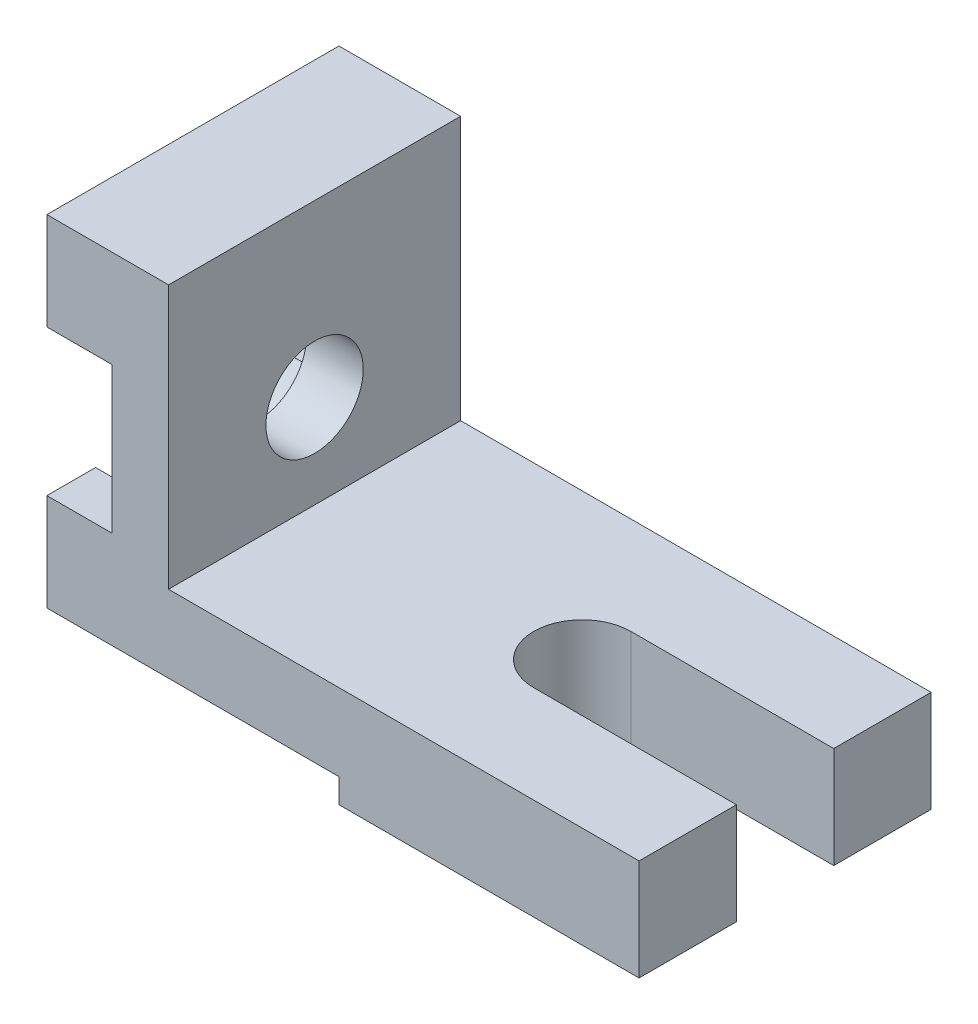
ISO-10303-21;
HEADER;
FILE_DESCRIPTION(('STEP AP214'),'2;1');
FILE_NAME('part.step','',(''),(''),'','','');
FILE_SCHEMA(('AUTOMOTIVE_DESIGN { 1 0 10303 214 1 1 1 1 }'));
ENDSEC;
DATA;
#1=APPLICATION_CONTEXT('core data for automotive mechanical design processes');
#2=APPLICATION_PROTOCOL_DEFINITION('international standard','automotive_design',2000,#1);
#3=PRODUCT_CONTEXT('',#1,'mechanical');
#4=PRODUCT('Part','Part','',(#3));
#5=PRODUCT_RELATED_PRODUCT_CATEGORY('part','',(#4));
#6=PRODUCT_DEFINITION_FORMATION('','',#4);
#7=PRODUCT_DEFINITION_CONTEXT('part definition',#1,'design');
#8=PRODUCT_DEFINITION('design','',#6,#7);
#9=PRODUCT_DEFINITION_SHAPE('','',#8);
#10=(LENGTH_UNIT() NAMED_UNIT(*) SI_UNIT(.MILLI.,.METRE.));
#11=(NAMED_UNIT(*) PLANE_ANGLE_UNIT() SI_UNIT($,.RADIAN.));
#12=(NAMED_UNIT(*) SI_UNIT($,.STERADIAN.) SOLID_ANGLE_UNIT());
#13=UNCERTAINTY_MEASURE_WITH_UNIT(LENGTH_MEASURE(1.E-05),#10,'distance_accuracy_value','');
#14=(GEOMETRIC_REPRESENTATION_CONTEXT(3) GLOBAL_UNCERTAINTY_ASSIGNED_CONTEXT((#13)) GLOBAL_UNIT_ASSIGNED_CONTEXT((#10,
#11,#12)) REPRESENTATION_CONTEXT('',''));
#15=CARTESIAN_POINT('',(0.,0.,0.));
#16=DIRECTION('',(0.,0.,1.));
#17=DIRECTION('',(1.,0.,0.));
#18=AXIS2_PLACEMENT_3D('',#15,#16,#17);
#19=CARTESIAN_POINT('',(-146.,0.,72.));
#20=DIRECTION('',(1.,0.,0.));
#21=DIRECTION('',(0.,0.,-1.));
#22=AXIS2_PLACEMENT_3D('',#19,#20,#21);
#23=PLANE('',#22);
#24=DIRECTION('',(0.,0.,1.));
#25=VECTOR('',#24,1.);
#26=CARTESIAN_POINT('',(-146.,66.,0.));
#27=LINE('',#26,#25);
#28=CARTESIAN_POINT('',(-146.,66.,60.));
#29=VERTEX_POINT('',#28);
#30=CARTESIAN_POINT('',(-146.,66.,72.));
#31=VERTEX_POINT('',#30);
#32=EDGE_CURVE('E187',#29,#31,#27,.T.);
#33=ORIENTED_EDGE('',*,*,#32,.T.);
#34=DIRECTION('',(0.,-1.,0.));
#35=VECTOR('',#34,1.);
#36=CARTESIAN_POINT('',(-146.,0.,72.));
#37=LINE('',#36,#35);
#38=CARTESIAN_POINT('',(-146.,90.,72.));
#39=VERTEX_POINT('',#38);
#40=EDGE_CURVE('E308',#39,#31,#37,.T.);
#41=ORIENTED_EDGE('',*,*,#40,.F.);
#42=DIRECTION('',(0.,0.,-1.));
#43=VECTOR('',#42,1.);
#44=CARTESIAN_POINT('',(-146.,90.,72.));
#45=LINE('',#44,#43);
#46=CARTESIAN_POINT('',(-146.,90.,0.));
#47=VERTEX_POINT('',#46);
#48=EDGE_CURVE('E334',#39,#47,#45,.T.);
#49=ORIENTED_EDGE('',*,*,#48,.T.);
#50=DIRECTION('',(0.,-1.,0.));
#51=VECTOR('',#50,1.);
#52=CARTESIAN_POINT('',(-146.,0.,0.));
#53=LINE('',#52,#51);
#54=CARTESIAN_POINT('',(-146.,66.,0.));
#55=VERTEX_POINT('',#54);
#56=EDGE_CURVE('E323',#47,#55,#53,.T.);
#57=ORIENTED_EDGE('',*,*,#56,.T.);
#58=DIRECTION('',(0.,0.,1.));
#59=VECTOR('',#58,1.);
#60=CARTESIAN_POINT('',(-146.,66.,0.));
#61=LINE('',#60,#59);
#62=CARTESIAN_POINT('',(-146.,66.,12.));
#63=VERTEX_POINT('',#62);
#64=EDGE_CURVE('E223',#55,#63,#61,.T.);
#65=ORIENTED_EDGE('',*,*,#64,.T.);
#66=CARTESIAN_POINT('',(-146.,48.,36.));
#67=DIRECTION('',(-1.,0.,0.));
#68=DIRECTION('',(0.,0.,1.));
#69=AXIS2_PLACEMENT_3D('',#66,#67,#68);
#70=CIRCLE('',#69,30.);
#71=EDGE_CURVE('E220',#29,#63,#70,.T.);
#72=ORIENTED_EDGE('',*,*,#71,.F.);
#73=EDGE_LOOP('',(#33,#41,#49,#57,#65,#72));
#74=FACE_BOUND('',#73,.T.);
#75=ADVANCED_FACE('F37',(#74),#23,.F.);
#76=CARTESIAN_POINT('',(0.,0.,72.));
#77=DIRECTION('',(0.,0.,-1.));
#78=DIRECTION('',(-1.,0.,0.));
#79=AXIS2_PLACEMENT_3D('',#76,#77,#78);
#80=PLANE('',#79);
#81=DIRECTION('',(-1.,0.,0.));
#82=VECTOR('',#81,1.);
#83=CARTESIAN_POINT('',(-130.,66.,72.));
#84=LINE('',#83,#82);
#85=CARTESIAN_POINT('',(-130.,66.,72.));
#86=VERTEX_POINT('',#85);
#87=EDGE_CURVE('E233',#86,#31,#84,.T.);
#88=ORIENTED_EDGE('',*,*,#87,.F.);
#89=DIRECTION('',(0.,1.,0.));
#90=VECTOR('',#89,1.);
#91=CARTESIAN_POINT('',(-130.,0.,72.));
#92=LINE('',#91,#90);
#93=CARTESIAN_POINT('',(-130.,30.,72.));
#94=VERTEX_POINT('',#93);
#95=EDGE_CURVE('E193',#94,#86,#92,.T.);
#96=ORIENTED_EDGE('',*,*,#95,.F.);
#97=DIRECTION('',(-1.,0.,0.));
#98=VECTOR('',#97,1.);
#99=CARTESIAN_POINT('',(-130.,30.,72.));
#100=LINE('',#99,#98);
#101=CARTESIAN_POINT('',(-146.,30.,72.));
#102=VERTEX_POINT('',#101);
#103=EDGE_CURVE('E236',#94,#102,#100,.T.);
#104=ORIENTED_EDGE('',*,*,#103,.T.);
#105=CARTESIAN_POINT('',(-146.,6.00000000000002,72.));
#106=VERTEX_POINT('',#105);
#107=EDGE_CURVE('E307',#102,#106,#37,.T.);
#108=ORIENTED_EDGE('',*,*,#107,.T.);
#109=DIRECTION('',(-1.,0.,0.));
#110=VECTOR('',#109,1.);
#111=CARTESIAN_POINT('',(-74.,6.00000000000002,72.));
#112=LINE('',#111,#110);
#113=CARTESIAN_POINT('',(-74.,6.00000000000002,72.));
#114=VERTEX_POINT('',#113);
#115=EDGE_CURVE('E258',#114,#106,#112,.T.);
#116=ORIENTED_EDGE('',*,*,#115,.F.);
#117=DIRECTION('',(0.,-1.,0.));
#118=VECTOR('',#117,1.);
#119=CARTESIAN_POINT('',(-74.,6.00000000000002,72.));
#120=LINE('',#119,#118);
#121=CARTESIAN_POINT('',(-74.,0.,72.));
#122=VERTEX_POINT('',#121);
#123=EDGE_CURVE('E250',#114,#122,#120,.T.);
#124=ORIENTED_EDGE('',*,*,#123,.T.);
#125=DIRECTION('',(1.,0.,0.));
#126=VECTOR('',#125,1.);
#127=CARTESIAN_POINT('',(0.,0.,72.));
#128=LINE('',#127,#126);
#129=CARTESIAN_POINT('',(0.,0.,72.));
#130=VERTEX_POINT('',#129);
#131=EDGE_CURVE('E311',#122,#130,#128,.T.);
#132=ORIENTED_EDGE('',*,*,#131,.T.);
#133=DIRECTION('',(0.,1.,0.));
#134=VECTOR('',#133,1.);
#135=CARTESIAN_POINT('',(0.,25.,72.));
#136=LINE('',#135,#134);
#137=CARTESIAN_POINT('',(0.,25.,72.));
#138=VERTEX_POINT('',#137);
#139=EDGE_CURVE('E297',#130,#138,#136,.T.);
#140=ORIENTED_EDGE('',*,*,#139,.T.);
#141=DIRECTION('',(-1.,0.,0.));
#142=VECTOR('',#141,1.);
#143=CARTESIAN_POINT('',(-116.,25.,72.));
#144=LINE('',#143,#142);
#145=CARTESIAN_POINT('',(-116.,25.,72.));
#146=VERTEX_POINT('',#145);
#147=EDGE_CURVE('E300',#138,#146,#144,.T.);
#148=ORIENTED_EDGE('',*,*,#147,.T.);
#149=DIRECTION('',(0.,1.,0.));
#150=VECTOR('',#149,1.);
#151=CARTESIAN_POINT('',(-116.,90.,72.));
#152=LINE('',#151,#150);
#153=CARTESIAN_POINT('',(-116.,90.,72.));
#154=VERTEX_POINT('',#153);
#155=EDGE_CURVE('E303',#146,#154,#152,.T.);
#156=ORIENTED_EDGE('',*,*,#155,.T.);
#157=DIRECTION('',(-1.,0.,0.));
#158=VECTOR('',#157,1.);
#159=CARTESIAN_POINT('',(-146.,90.,72.));
#160=LINE('',#159,#158);
#161=EDGE_CURVE('E305',#154,#39,#160,.T.);
#162=ORIENTED_EDGE('',*,*,#161,.T.);
#163=ORIENTED_EDGE('',*,*,#40,.T.);
#164=EDGE_LOOP('',(#88,#96,#104,#108,#116,#124,#132,#140,#148,#156,#162,#163));
#165=FACE_BOUND('',#164,.T.);
#166=ADVANCED_FACE('F384',(#165),#80,.F.);
#167=CARTESIAN_POINT('',(0.,25.,72.));
#168=DIRECTION('',(-1.,0.,0.));
#169=DIRECTION('',(0.,-1.,0.));
#170=AXIS2_PLACEMENT_3D('',#167,#168,#169);
#171=PLANE('',#170);
#172=DIRECTION('',(0.,-1.,0.));
#173=VECTOR('',#172,1.);
#174=CARTESIAN_POINT('',(0.,257.513440471728,24.));
#175=LINE('',#174,#173);
#176=CARTESIAN_POINT('',(0.,25.,24.));
#177=VERTEX_POINT('',#176);
#178=CARTESIAN_POINT('',(0.,0.,24.));
#179=VERTEX_POINT('',#178);
#180=EDGE_CURVE('E293',#177,#179,#175,.T.);
#181=ORIENTED_EDGE('',*,*,#180,.T.);
#182=DIRECTION('',(0.,0.,-1.));
#183=VECTOR('',#182,1.);
#184=CARTESIAN_POINT('',(0.,0.,72.));
#185=LINE('',#184,#183);
#186=CARTESIAN_POINT('',(0.,0.,0.));
#187=VERTEX_POINT('',#186);
#188=EDGE_CURVE('E313',#179,#187,#185,.T.);
#189=ORIENTED_EDGE('',*,*,#188,.T.);
#190=DIRECTION('',(0.,1.,0.));
#191=VECTOR('',#190,1.);
#192=CARTESIAN_POINT('',(0.,25.,0.));
#193=LINE('',#192,#191);
#194=CARTESIAN_POINT('',(0.,25.,0.));
#195=VERTEX_POINT('',#194);
#196=EDGE_CURVE('E296',#187,#195,#193,.T.);
#197=ORIENTED_EDGE('',*,*,#196,.T.);
#198=DIRECTION('',(0.,0.,-1.));
#199=VECTOR('',#198,1.);
#200=CARTESIAN_POINT('',(0.,25.,72.));
#201=LINE('',#200,#199);
#202=EDGE_CURVE('E45',#177,#195,#201,.T.);
#203=ORIENTED_EDGE('',*,*,#202,.F.);
#204=EDGE_LOOP('',(#181,#189,#197,#203));
#205=FACE_BOUND('',#204,.T.);
#206=ADVANCED_FACE('F39',(#205),#171,.F.);
#207=DIRECTION('',(0.,-1.,0.));
#208=VECTOR('',#207,1.);
#209=CARTESIAN_POINT('',(0.,257.513440471728,48.));
#210=LINE('',#209,#208);
#211=CARTESIAN_POINT('',(0.,25.,48.));
#212=VERTEX_POINT('',#211);
#213=CARTESIAN_POINT('',(0.,0.,48.));
#214=VERTEX_POINT('',#213);
#215=EDGE_CURVE('E273',#212,#214,#210,.T.);
#216=ORIENTED_EDGE('',*,*,#215,.F.);
#217=EDGE_CURVE('E11',#138,#212,#201,.T.);
#218=ORIENTED_EDGE('',*,*,#217,.F.);
#219=ORIENTED_EDGE('',*,*,#139,.F.);
#220=EDGE_CURVE('E328',#130,#214,#185,.T.);
#221=ORIENTED_EDGE('',*,*,#220,.T.);
#222=EDGE_LOOP('',(#216,#218,#219,#221));
#223=FACE_BOUND('',#222,.T.);
#224=ADVANCED_FACE('F400',(#223),#171,.F.);
#225=CARTESIAN_POINT('',(-116.,25.,72.));
#226=DIRECTION('',(0.,-1.,0.));
#227=DIRECTION('',(0.,0.,-1.));
#228=AXIS2_PLACEMENT_3D('',#225,#226,#227);
#229=PLANE('',#228);
#230=DIRECTION('',(1.,0.,0.));
#231=VECTOR('',#230,1.);
#232=CARTESIAN_POINT('',(0.,25.,24.));
#233=LINE('',#232,#231);
#234=CARTESIAN_POINT('',(-50.,25.,24.));
#235=VERTEX_POINT('',#234);
#236=EDGE_CURVE('E265',#235,#177,#233,.T.);
#237=ORIENTED_EDGE('',*,*,#236,.T.);
#238=ORIENTED_EDGE('',*,*,#202,.T.);
#239=DIRECTION('',(-1.,0.,0.));
#240=VECTOR('',#239,1.);
#241=CARTESIAN_POINT('',(-116.,25.,0.));
#242=LINE('',#241,#240);
#243=CARTESIAN_POINT('',(-116.,25.,0.));
#244=VERTEX_POINT('',#243);
#245=EDGE_CURVE('E316',#195,#244,#242,.T.);
#246=ORIENTED_EDGE('',*,*,#245,.T.);
#247=DIRECTION('',(0.,0.,-1.));
#248=VECTOR('',#247,1.);
#249=CARTESIAN_POINT('',(-116.,25.,72.));
#250=LINE('',#249,#248);
#251=EDGE_CURVE('E339',#146,#244,#250,.T.);
#252=ORIENTED_EDGE('',*,*,#251,.F.);
#253=ORIENTED_EDGE('',*,*,#147,.F.);
#254=ORIENTED_EDGE('',*,*,#217,.T.);
#255=DIRECTION('',(-1.,0.,0.));
#256=VECTOR('',#255,1.);
#257=CARTESIAN_POINT('',(0.,25.,48.));
#258=LINE('',#257,#256);
#259=CARTESIAN_POINT('',(-50.,25.,48.));
#260=VERTEX_POINT('',#259);
#261=EDGE_CURVE('E278',#212,#260,#258,.T.);
#262=ORIENTED_EDGE('',*,*,#261,.T.);
#263=CARTESIAN_POINT('',(-50.,25.,36.));
#264=DIRECTION('',(0.,-1.,0.));
#265=DIRECTION('',(0.,0.,-1.));
#266=AXIS2_PLACEMENT_3D('',#263,#264,#265);
#267=CIRCLE('',#266,12.);
#268=EDGE_CURVE('E282',#260,#235,#267,.T.);
#269=ORIENTED_EDGE('',*,*,#268,.T.);
#270=EDGE_LOOP('',(#237,#238,#246,#252,#253,#254,#262,#269));
#271=FACE_BOUND('',#270,.T.);
#272=ADVANCED_FACE('F348',(#271),#229,.F.);
#273=CARTESIAN_POINT('',(0.,0.,72.));
#274=DIRECTION('',(0.,1.,0.));
#275=DIRECTION('',(0.,0.,1.));
#276=AXIS2_PLACEMENT_3D('',#273,#274,#275);
#277=PLANE('',#276);
#278=DIRECTION('',(0.,0.,1.));
#279=VECTOR('',#278,1.);
#280=CARTESIAN_POINT('',(-74.,0.,22.));
#281=LINE('',#280,#279);
#282=CARTESIAN_POINT('',(-74.,0.,22.));
#283=VERTEX_POINT('',#282);
#284=EDGE_CURVE('E60',#283,#122,#281,.T.);
#285=ORIENTED_EDGE('',*,*,#284,.F.);
#286=DIRECTION('',(-1.,0.,0.));
#287=VECTOR('',#286,1.);
#288=CARTESIAN_POINT('',(-74.,0.,22.));
#289=LINE('',#288,#287);
#290=CARTESIAN_POINT('',(-146.,0.,22.));
#291=VERTEX_POINT('',#290);
#292=EDGE_CURVE('E262',#283,#291,#289,.T.);
#293=ORIENTED_EDGE('',*,*,#292,.T.);
#294=DIRECTION('',(0.,0.,-1.));
#295=VECTOR('',#294,1.);
#296=CARTESIAN_POINT('',(-146.,0.,72.));
#297=LINE('',#296,#295);
#298=CARTESIAN_POINT('',(-146.,0.,0.));
#299=VERTEX_POINT('',#298);
#300=EDGE_CURVE('E331',#291,#299,#297,.T.);
#301=ORIENTED_EDGE('',*,*,#300,.T.);
#302=DIRECTION('',(1.,0.,0.));
#303=VECTOR('',#302,1.);
#304=CARTESIAN_POINT('',(0.,0.,0.));
#305=LINE('',#304,#303);
#306=EDGE_CURVE('E301',#299,#187,#305,.T.);
#307=ORIENTED_EDGE('',*,*,#306,.T.);
#308=ORIENTED_EDGE('',*,*,#188,.F.);
#309=DIRECTION('',(1.,0.,0.));
#310=VECTOR('',#309,1.);
#311=CARTESIAN_POINT('',(0.,0.,24.));
#312=LINE('',#311,#310);
#313=CARTESIAN_POINT('',(-50.,0.,24.));
#314=VERTEX_POINT('',#313);
#315=EDGE_CURVE('E270',#314,#179,#312,.T.);
#316=ORIENTED_EDGE('',*,*,#315,.F.);
#317=CARTESIAN_POINT('',(-50.,0.,36.));
#318=DIRECTION('',(0.,-1.,0.));
#319=DIRECTION('',(0.,0.,-1.));
#320=AXIS2_PLACEMENT_3D('',#317,#318,#319);
#321=CIRCLE('',#320,12.);
#322=CARTESIAN_POINT('',(-50.,0.,48.));
#323=VERTEX_POINT('',#322);
#324=EDGE_CURVE('E274',#323,#314,#321,.T.);
#325=ORIENTED_EDGE('',*,*,#324,.F.);
#326=DIRECTION('',(-1.,0.,0.));
#327=VECTOR('',#326,1.);
#328=CARTESIAN_POINT('',(0.,0.,48.));
#329=LINE('',#328,#327);
#330=EDGE_CURVE('E275',#214,#323,#329,.T.);
#331=ORIENTED_EDGE('',*,*,#330,.F.);
#332=ORIENTED_EDGE('',*,*,#220,.F.);
#333=ORIENTED_EDGE('',*,*,#131,.F.);
#334=EDGE_LOOP('',(#285,#293,#301,#307,#308,#316,#325,#331,#332,#333));
#335=FACE_BOUND('',#334,.T.);
#336=ADVANCED_FACE('F359',(#335),#277,.F.);
#337=CARTESIAN_POINT('',(-116.,90.,72.));
#338=DIRECTION('',(-1.,0.,0.));
#339=DIRECTION('',(0.,-1.,0.));
#340=AXIS2_PLACEMENT_3D('',#337,#338,#339);
#341=PLANE('',#340);
#342=CARTESIAN_POINT('',(-116.,48.,36.));
#343=DIRECTION('',(-1.,0.,0.));
#344=DIRECTION('',(0.,-1.,0.));
#345=AXIS2_PLACEMENT_3D('',#342,#343,#344);
#346=CIRCLE('',#345,12.);
#347=CARTESIAN_POINT('',(-116.,36.,36.));
#348=VERTEX_POINT('',#347);
#349=EDGE_CURVE('E221',#348,#348,#346,.T.);
#350=ORIENTED_EDGE('',*,*,#349,.T.);
#351=EDGE_LOOP('',(#350));
#352=FACE_BOUND('',#351,.T.);
#353=DIRECTION('',(0.,1.,0.));
#354=VECTOR('',#353,1.);
#355=CARTESIAN_POINT('',(-116.,90.,0.));
#356=LINE('',#355,#354);
#357=CARTESIAN_POINT('',(-116.,90.,0.));
#358=VERTEX_POINT('',#357);
#359=EDGE_CURVE('E318',#244,#358,#356,.T.);
#360=ORIENTED_EDGE('',*,*,#359,.T.);
#361=DIRECTION('',(0.,0.,-1.));
#362=VECTOR('',#361,1.);
#363=CARTESIAN_POINT('',(-116.,90.,72.));
#364=LINE('',#363,#362);
#365=EDGE_CURVE('E337',#154,#358,#364,.T.);
#366=ORIENTED_EDGE('',*,*,#365,.F.);
#367=ORIENTED_EDGE('',*,*,#155,.F.);
#368=ORIENTED_EDGE('',*,*,#251,.T.);
#369=EDGE_LOOP('',(#360,#366,#367,#368));
#370=FACE_BOUND('',#369,.T.);
#371=ADVANCED_FACE('F382',(#352,#370),#341,.F.);
#372=CARTESIAN_POINT('',(-146.,90.,72.));
#373=DIRECTION('',(0.,-1.,0.));
#374=DIRECTION('',(0.,0.,-1.));
#375=AXIS2_PLACEMENT_3D('',#372,#373,#374);
#376=PLANE('',#375);
#377=DIRECTION('',(-1.,0.,0.));
#378=VECTOR('',#377,1.);
#379=CARTESIAN_POINT('',(-146.,90.,0.));
#380=LINE('',#379,#378);
#381=EDGE_CURVE('E320',#358,#47,#380,.T.);
#382=ORIENTED_EDGE('',*,*,#381,.T.);
#383=ORIENTED_EDGE('',*,*,#48,.F.);
#384=ORIENTED_EDGE('',*,*,#161,.F.);
#385=ORIENTED_EDGE('',*,*,#365,.T.);
#386=EDGE_LOOP('',(#382,#383,#384,#385));
#387=FACE_BOUND('',#386,.T.);
#388=ADVANCED_FACE('F380',(#387),#376,.F.);
#389=ORIENTED_EDGE('',*,*,#107,.F.);
#390=DIRECTION('',(0.,0.,1.));
#391=VECTOR('',#390,1.);
#392=CARTESIAN_POINT('',(-146.,30.,0.));
#393=LINE('',#392,#391);
#394=CARTESIAN_POINT('',(-146.,30.,60.));
#395=VERTEX_POINT('',#394);
#396=EDGE_CURVE('E200',#395,#102,#393,.T.);
#397=ORIENTED_EDGE('',*,*,#396,.F.);
#398=CARTESIAN_POINT('',(-146.,48.,36.));
#399=DIRECTION('',(-1.,0.,0.));
#400=DIRECTION('',(0.,0.,1.));
#401=AXIS2_PLACEMENT_3D('',#398,#399,#400);
#402=CIRCLE('',#401,30.);
#403=CARTESIAN_POINT('',(-146.,30.,12.));
#404=VERTEX_POINT('',#403);
#405=EDGE_CURVE('E229',#404,#395,#402,.T.);
#406=ORIENTED_EDGE('',*,*,#405,.F.);
#407=DIRECTION('',(0.,0.,1.));
#408=VECTOR('',#407,1.);
#409=CARTESIAN_POINT('',(-146.,30.,0.));
#410=LINE('',#409,#408);
#411=CARTESIAN_POINT('',(-146.,30.,0.));
#412=VERTEX_POINT('',#411);
#413=EDGE_CURVE('E226',#412,#404,#410,.T.);
#414=ORIENTED_EDGE('',*,*,#413,.F.);
#415=EDGE_CURVE('E322',#412,#299,#53,.T.);
#416=ORIENTED_EDGE('',*,*,#415,.T.);
#417=ORIENTED_EDGE('',*,*,#300,.F.);
#418=DIRECTION('',(0.,-1.,0.));
#419=VECTOR('',#418,1.);
#420=CARTESIAN_POINT('',(-146.,6.00000000000001,22.));
#421=LINE('',#420,#419);
#422=CARTESIAN_POINT('',(-146.,6.00000000000001,22.));
#423=VERTEX_POINT('',#422);
#424=EDGE_CURVE('E251',#423,#291,#421,.T.);
#425=ORIENTED_EDGE('',*,*,#424,.F.);
#426=DIRECTION('',(0.,0.,-1.));
#427=VECTOR('',#426,1.);
#428=CARTESIAN_POINT('',(-146.,6.00000000000002,72.));
#429=LINE('',#428,#427);
#430=EDGE_CURVE('E235',#106,#423,#429,.T.);
#431=ORIENTED_EDGE('',*,*,#430,.F.);
#432=EDGE_LOOP('',(#389,#397,#406,#414,#416,#417,#425,#431));
#433=FACE_BOUND('',#432,.T.);
#434=ADVANCED_FACE('F366',(#433),#23,.F.);
#435=CARTESIAN_POINT('',(0.,0.,0.));
#436=DIRECTION('',(0.,0.,-1.));
#437=DIRECTION('',(-1.,0.,0.));
#438=AXIS2_PLACEMENT_3D('',#435,#436,#437);
#439=PLANE('',#438);
#440=DIRECTION('',(-1.,0.,0.));
#441=VECTOR('',#440,1.);
#442=CARTESIAN_POINT('',(-130.,30.,0.));
#443=LINE('',#442,#441);
#444=CARTESIAN_POINT('',(-130.,30.,0.));
#445=VERTEX_POINT('',#444);
#446=EDGE_CURVE('E243',#445,#412,#443,.T.);
#447=ORIENTED_EDGE('',*,*,#446,.F.);
#448=DIRECTION('',(0.,-1.,0.));
#449=VECTOR('',#448,1.);
#450=CARTESIAN_POINT('',(-130.,0.,0.));
#451=LINE('',#450,#449);
#452=CARTESIAN_POINT('',(-130.,66.,0.));
#453=VERTEX_POINT('',#452);
#454=EDGE_CURVE('E205',#453,#445,#451,.T.);
#455=ORIENTED_EDGE('',*,*,#454,.F.);
#456=DIRECTION('',(-1.,0.,0.));
#457=VECTOR('',#456,1.);
#458=CARTESIAN_POINT('',(-130.,66.,0.));
#459=LINE('',#458,#457);
#460=EDGE_CURVE('E245',#453,#55,#459,.T.);
#461=ORIENTED_EDGE('',*,*,#460,.T.);
#462=ORIENTED_EDGE('',*,*,#56,.F.);
#463=ORIENTED_EDGE('',*,*,#381,.F.);
#464=ORIENTED_EDGE('',*,*,#359,.F.);
#465=ORIENTED_EDGE('',*,*,#245,.F.);
#466=ORIENTED_EDGE('',*,*,#196,.F.);
#467=ORIENTED_EDGE('',*,*,#306,.F.);
#468=ORIENTED_EDGE('',*,*,#415,.F.);
#469=EDGE_LOOP('',(#447,#455,#461,#462,#463,#464,#465,#466,#467,#468));
#470=FACE_BOUND('',#469,.T.);
#471=ADVANCED_FACE('F355',(#470),#439,.T.);
#472=CARTESIAN_POINT('',(0.,257.513440471728,24.));
#473=DIRECTION('',(0.,0.,1.));
#474=DIRECTION('',(1.,0.,0.));
#475=AXIS2_PLACEMENT_3D('',#472,#473,#474);
#476=PLANE('',#475);
#477=ORIENTED_EDGE('',*,*,#236,.F.);
#478=DIRECTION('',(0.,-1.,0.));
#479=VECTOR('',#478,1.);
#480=CARTESIAN_POINT('',(-50.,257.513440471728,24.));
#481=LINE('',#480,#479);
#482=EDGE_CURVE('E290',#235,#314,#481,.T.);
#483=ORIENTED_EDGE('',*,*,#482,.T.);
#484=ORIENTED_EDGE('',*,*,#315,.T.);
#485=ORIENTED_EDGE('',*,*,#180,.F.);
#486=EDGE_LOOP('',(#477,#483,#484,#485));
#487=FACE_BOUND('',#486,.T.);
#488=ADVANCED_FACE('F397',(#487),#476,.T.);
#489=CARTESIAN_POINT('',(-50.,257.513440471728,36.));
#490=DIRECTION('',(0.,-1.,0.));
#491=DIRECTION('',(0.,0.,-1.));
#492=AXIS2_PLACEMENT_3D('',#489,#490,#491);
#493=CYLINDRICAL_SURFACE('',#492,12.);
#494=ORIENTED_EDGE('',*,*,#268,.F.);
#495=DIRECTION('',(0.,-1.,0.));
#496=VECTOR('',#495,1.);
#497=CARTESIAN_POINT('',(-50.,257.513440471728,48.));
#498=LINE('',#497,#496);
#499=EDGE_CURVE('E287',#260,#323,#498,.T.);
#500=ORIENTED_EDGE('',*,*,#499,.T.);
#501=ORIENTED_EDGE('',*,*,#324,.T.);
#502=ORIENTED_EDGE('',*,*,#482,.F.);
#503=EDGE_LOOP('',(#494,#500,#501,#502));
#504=FACE_BOUND('',#503,.T.);
#505=ADVANCED_FACE('F394',(#504),#493,.F.);
#506=CARTESIAN_POINT('',(0.,257.513440471728,48.));
#507=DIRECTION('',(0.,0.,-1.));
#508=DIRECTION('',(-1.,0.,0.));
#509=AXIS2_PLACEMENT_3D('',#506,#507,#508);
#510=PLANE('',#509);
#511=ORIENTED_EDGE('',*,*,#261,.F.);
#512=ORIENTED_EDGE('',*,*,#215,.T.);
#513=ORIENTED_EDGE('',*,*,#330,.T.);
#514=ORIENTED_EDGE('',*,*,#499,.F.);
#515=EDGE_LOOP('',(#511,#512,#513,#514));
#516=FACE_BOUND('',#515,.T.);
#517=ADVANCED_FACE('F392',(#516),#510,.T.);
#518=CARTESIAN_POINT('',(-74.,6.00000000000001,22.));
#519=DIRECTION('',(0.,0.,-1.));
#520=DIRECTION('',(-1.,0.,0.));
#521=AXIS2_PLACEMENT_3D('',#518,#519,#520);
#522=PLANE('',#521);
#523=ORIENTED_EDGE('',*,*,#424,.T.);
#524=ORIENTED_EDGE('',*,*,#292,.F.);
#525=DIRECTION('',(0.,-1.,0.));
#526=VECTOR('',#525,1.);
#527=CARTESIAN_POINT('',(-74.,6.00000000000001,22.));
#528=LINE('',#527,#526);
#529=CARTESIAN_POINT('',(-74.,6.00000000000001,22.));
#530=VERTEX_POINT('',#529);
#531=EDGE_CURVE('E256',#530,#283,#528,.T.);
#532=ORIENTED_EDGE('',*,*,#531,.F.);
#533=DIRECTION('',(-1.,0.,0.));
#534=VECTOR('',#533,1.);
#535=CARTESIAN_POINT('',(-74.,6.00000000000001,22.));
#536=LINE('',#535,#534);
#537=EDGE_CURVE('E266',#530,#423,#536,.T.);
#538=ORIENTED_EDGE('',*,*,#537,.T.);
#539=EDGE_LOOP('',(#523,#524,#532,#538));
#540=FACE_BOUND('',#539,.T.);
#541=ADVANCED_FACE('F466',(#540),#522,.F.);
#542=CARTESIAN_POINT('',(-74.,6.00000000000002,72.));
#543=DIRECTION('',(0.,1.,0.));
#544=DIRECTION('',(0.,0.,1.));
#545=AXIS2_PLACEMENT_3D('',#542,#543,#544);
#546=PLANE('',#545);
#547=ORIENTED_EDGE('',*,*,#430,.T.);
#548=ORIENTED_EDGE('',*,*,#537,.F.);
#549=DIRECTION('',(0.,0.,-1.));
#550=VECTOR('',#549,1.);
#551=CARTESIAN_POINT('',(-74.,6.00000000000002,72.));
#552=LINE('',#551,#550);
#553=EDGE_CURVE('E253',#114,#530,#552,.T.);
#554=ORIENTED_EDGE('',*,*,#553,.F.);
#555=ORIENTED_EDGE('',*,*,#115,.T.);
#556=EDGE_LOOP('',(#547,#548,#554,#555));
#557=FACE_BOUND('',#556,.T.);
#558=ADVANCED_FACE('F465',(#557),#546,.F.);
#559=CARTESIAN_POINT('',(-74.,0.,0.));
#560=DIRECTION('',(1.,0.,0.));
#561=DIRECTION('',(0.,0.,-1.));
#562=AXIS2_PLACEMENT_3D('',#559,#560,#561);
#563=PLANE('',#562);
#564=ORIENTED_EDGE('',*,*,#284,.T.);
#565=ORIENTED_EDGE('',*,*,#123,.F.);
#566=ORIENTED_EDGE('',*,*,#553,.T.);
#567=ORIENTED_EDGE('',*,*,#531,.T.);
#568=EDGE_LOOP('',(#564,#565,#566,#567));
#569=FACE_BOUND('',#568,.T.);
#570=ADVANCED_FACE('F462',(#569),#563,.F.);
#571=CARTESIAN_POINT('',(-130.,66.,0.));
#572=DIRECTION('',(0.,-1.,0.));
#573=DIRECTION('',(0.,0.,-1.));
#574=AXIS2_PLACEMENT_3D('',#571,#572,#573);
#575=PLANE('',#574);
#576=ORIENTED_EDGE('',*,*,#32,.F.);
#577=DIRECTION('',(-1.,0.,0.));
#578=VECTOR('',#577,1.);
#579=CARTESIAN_POINT('',(-130.,66.,60.));
#580=LINE('',#579,#578);
#581=CARTESIAN_POINT('',(-130.,66.,60.));
#582=VERTEX_POINT('',#581);
#583=EDGE_CURVE('E181',#582,#29,#580,.T.);
#584=ORIENTED_EDGE('',*,*,#583,.F.);
#585=DIRECTION('',(0.,0.,1.));
#586=VECTOR('',#585,1.);
#587=CARTESIAN_POINT('',(-130.,66.,0.));
#588=LINE('',#587,#586);
#589=EDGE_CURVE('E184',#582,#86,#588,.T.);
#590=ORIENTED_EDGE('',*,*,#589,.T.);
#591=ORIENTED_EDGE('',*,*,#87,.T.);
#592=EDGE_LOOP('',(#576,#584,#590,#591));
#593=FACE_BOUND('',#592,.T.);
#594=ADVANCED_FACE('F183',(#593),#575,.T.);
#595=CARTESIAN_POINT('',(-130.,30.,0.));
#596=DIRECTION('',(0.,-1.,0.));
#597=DIRECTION('',(0.,0.,-1.));
#598=AXIS2_PLACEMENT_3D('',#595,#596,#597);
#599=PLANE('',#598);
#600=ORIENTED_EDGE('',*,*,#396,.T.);
#601=ORIENTED_EDGE('',*,*,#103,.F.);
#602=DIRECTION('',(0.,0.,1.));
#603=VECTOR('',#602,1.);
#604=CARTESIAN_POINT('',(-130.,30.,0.));
#605=LINE('',#604,#603);
#606=CARTESIAN_POINT('',(-130.,30.,60.));
#607=VERTEX_POINT('',#606);
#608=EDGE_CURVE('E216',#607,#94,#605,.T.);
#609=ORIENTED_EDGE('',*,*,#608,.F.);
#610=DIRECTION('',(-1.,0.,0.));
#611=VECTOR('',#610,1.);
#612=CARTESIAN_POINT('',(-130.,30.,60.));
#613=LINE('',#612,#611);
#614=EDGE_CURVE('E239',#607,#395,#613,.T.);
#615=ORIENTED_EDGE('',*,*,#614,.T.);
#616=EDGE_LOOP('',(#600,#601,#609,#615));
#617=FACE_BOUND('',#616,.T.);
#618=ADVANCED_FACE('F448',(#617),#599,.F.);
#619=CARTESIAN_POINT('',(-130.,48.,36.));
#620=DIRECTION('',(-1.,0.,0.));
#621=DIRECTION('',(0.,0.,1.));
#622=AXIS2_PLACEMENT_3D('',#619,#620,#621);
#623=CYLINDRICAL_SURFACE('',#622,30.);
#624=ORIENTED_EDGE('',*,*,#405,.T.);
#625=ORIENTED_EDGE('',*,*,#614,.F.);
#626=CARTESIAN_POINT('',(-130.,48.,36.));
#627=DIRECTION('',(-1.,0.,0.));
#628=DIRECTION('',(0.,0.,1.));
#629=AXIS2_PLACEMENT_3D('',#626,#627,#628);
#630=CIRCLE('',#629,30.);
#631=CARTESIAN_POINT('',(-130.,30.,12.));
#632=VERTEX_POINT('',#631);
#633=EDGE_CURVE('E213',#632,#607,#630,.T.);
#634=ORIENTED_EDGE('',*,*,#633,.F.);
#635=DIRECTION('',(-1.,0.,0.));
#636=VECTOR('',#635,1.);
#637=CARTESIAN_POINT('',(-130.,30.,12.));
#638=LINE('',#637,#636);
#639=EDGE_CURVE('E241',#632,#404,#638,.T.);
#640=ORIENTED_EDGE('',*,*,#639,.T.);
#641=EDGE_LOOP('',(#624,#625,#634,#640));
#642=FACE_BOUND('',#641,.T.);
#643=ADVANCED_FACE('F451',(#642),#623,.F.);
#644=CARTESIAN_POINT('',(-130.,30.,0.));
#645=DIRECTION('',(0.,-1.,0.));
#646=DIRECTION('',(0.,0.,-1.));
#647=AXIS2_PLACEMENT_3D('',#644,#645,#646);
#648=PLANE('',#647);
#649=ORIENTED_EDGE('',*,*,#413,.T.);
#650=ORIENTED_EDGE('',*,*,#639,.F.);
#651=DIRECTION('',(0.,0.,1.));
#652=VECTOR('',#651,1.);
#653=CARTESIAN_POINT('',(-130.,30.,0.));
#654=LINE('',#653,#652);
#655=EDGE_CURVE('E210',#445,#632,#654,.T.);
#656=ORIENTED_EDGE('',*,*,#655,.F.);
#657=ORIENTED_EDGE('',*,*,#446,.T.);
#658=EDGE_LOOP('',(#649,#650,#656,#657));
#659=FACE_BOUND('',#658,.T.);
#660=ADVANCED_FACE('F371',(#659),#648,.F.);
#661=CARTESIAN_POINT('',(-130.,66.,0.));
#662=DIRECTION('',(0.,-1.,0.));
#663=DIRECTION('',(0.,0.,-1.));
#664=AXIS2_PLACEMENT_3D('',#661,#662,#663);
#665=PLANE('',#664);
#666=ORIENTED_EDGE('',*,*,#64,.F.);
#667=ORIENTED_EDGE('',*,*,#460,.F.);
#668=DIRECTION('',(0.,0.,1.));
#669=VECTOR('',#668,1.);
#670=CARTESIAN_POINT('',(-130.,66.,0.));
#671=LINE('',#670,#669);
#672=CARTESIAN_POINT('',(-130.,66.,12.));
#673=VERTEX_POINT('',#672);
#674=EDGE_CURVE('E52',#453,#673,#671,.T.);
#675=ORIENTED_EDGE('',*,*,#674,.T.);
#676=DIRECTION('',(-1.,0.,0.));
#677=VECTOR('',#676,1.);
#678=CARTESIAN_POINT('',(-130.,66.,12.));
#679=LINE('',#678,#677);
#680=EDGE_CURVE('E192',#673,#63,#679,.T.);
#681=ORIENTED_EDGE('',*,*,#680,.T.);
#682=EDGE_LOOP('',(#666,#667,#675,#681));
#683=FACE_BOUND('',#682,.T.);
#684=ADVANCED_FACE('F445',(#683),#665,.T.);
#685=CARTESIAN_POINT('',(-130.,48.,36.));
#686=DIRECTION('',(-1.,0.,0.));
#687=DIRECTION('',(0.,0.,1.));
#688=AXIS2_PLACEMENT_3D('',#685,#686,#687);
#689=CYLINDRICAL_SURFACE('',#688,30.);
#690=ORIENTED_EDGE('',*,*,#71,.T.);
#691=ORIENTED_EDGE('',*,*,#680,.F.);
#692=CARTESIAN_POINT('',(-130.,48.,36.));
#693=DIRECTION('',(-1.,0.,0.));
#694=DIRECTION('',(0.,0.,1.));
#695=AXIS2_PLACEMENT_3D('',#692,#693,#694);
#696=CIRCLE('',#695,30.);
#697=EDGE_CURVE('E196',#582,#673,#696,.T.);
#698=ORIENTED_EDGE('',*,*,#697,.F.);
#699=ORIENTED_EDGE('',*,*,#583,.T.);
#700=EDGE_LOOP('',(#690,#691,#698,#699));
#701=FACE_BOUND('',#700,.T.);
#702=ADVANCED_FACE('F203',(#701),#689,.F.);
#703=CARTESIAN_POINT('',(-130.,0.,0.));
#704=DIRECTION('',(-1.,0.,0.));
#705=DIRECTION('',(0.,0.,1.));
#706=AXIS2_PLACEMENT_3D('',#703,#704,#705);
#707=PLANE('',#706);
#708=CARTESIAN_POINT('',(-130.,48.,36.));
#709=DIRECTION('',(-1.,0.,0.));
#710=DIRECTION('',(0.,0.,1.));
#711=AXIS2_PLACEMENT_3D('',#708,#709,#710);
#712=CIRCLE('',#711,12.);
#713=CARTESIAN_POINT('',(-130.,48.,48.));
#714=VERTEX_POINT('',#713);
#715=EDGE_CURVE('E431',#714,#714,#712,.T.);
#716=ORIENTED_EDGE('',*,*,#715,.F.);
#717=EDGE_LOOP('',(#716));
#718=FACE_BOUND('',#717,.T.);
#719=ORIENTED_EDGE('',*,*,#589,.F.);
#720=ORIENTED_EDGE('',*,*,#697,.T.);
#721=ORIENTED_EDGE('',*,*,#674,.F.);
#722=ORIENTED_EDGE('',*,*,#454,.T.);
#723=ORIENTED_EDGE('',*,*,#655,.T.);
#724=ORIENTED_EDGE('',*,*,#633,.T.);
#725=ORIENTED_EDGE('',*,*,#608,.T.);
#726=ORIENTED_EDGE('',*,*,#95,.T.);
#727=EDGE_LOOP('',(#719,#720,#721,#722,#723,#724,#725,#726));
#728=FACE_BOUND('',#727,.T.);
#729=ADVANCED_FACE('F195',(#718,#728),#707,.T.);
#730=CARTESIAN_POINT('',(-114.,48.,36.));
#731=DIRECTION('',(-1.,0.,0.));
#732=DIRECTION('',(0.,0.,1.));
#733=AXIS2_PLACEMENT_3D('',#730,#731,#732);
#734=CYLINDRICAL_SURFACE('',#733,12.);
#735=ORIENTED_EDGE('',*,*,#715,.T.);
#736=EDGE_LOOP('',(#735));
#737=FACE_BOUND('',#736,.T.);
#738=ORIENTED_EDGE('',*,*,#349,.F.);
#739=EDGE_LOOP('',(#738));
#740=FACE_BOUND('',#739,.T.);
#741=ADVANCED_FACE('F436',(#737,#740),#734,.F.);
#742=CLOSED_SHELL('',(#75,#166,#206,#224,#272,#336,#371,#388,#434,#471,#488,#505,#517,#541,#558,
#570,#594,#618,#643,#660,#684,#702,#729,#741));
#743=MANIFOLD_SOLID_BREP('B2',#742);
#744=ADVANCED_BREP_SHAPE_REPRESENTATION('',(#18,#743),#14);
#745=SHAPE_DEFINITION_REPRESENTATION(#9,#744);
ENDSEC;
END-ISO-10303-21;
